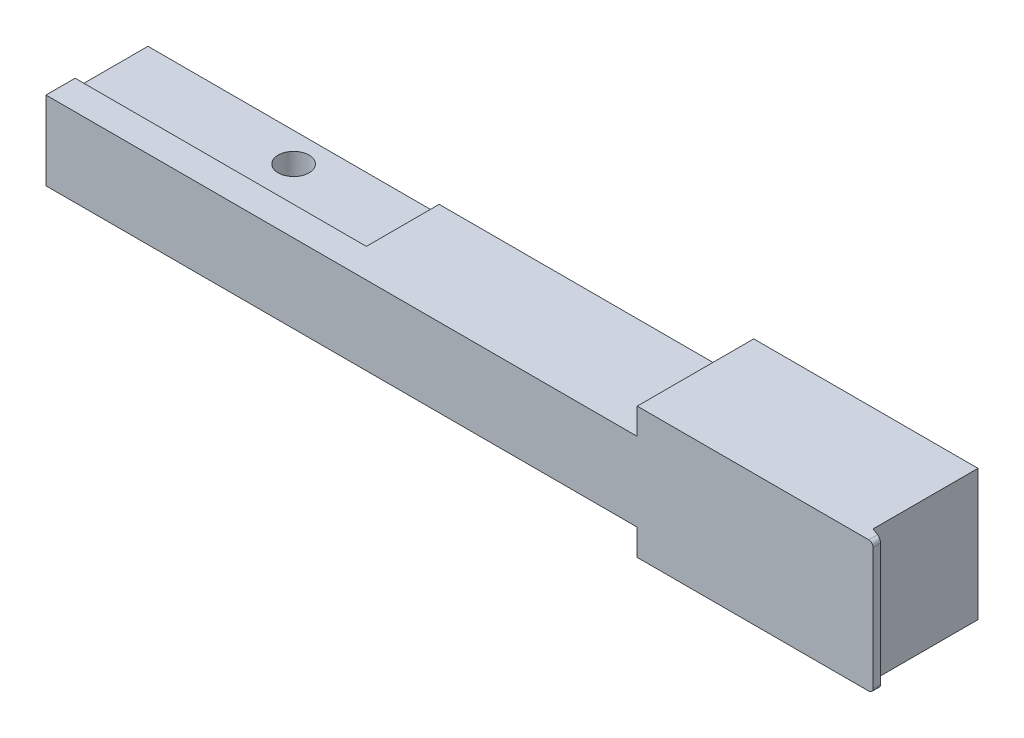
ISO-10303-21;
HEADER;
FILE_DESCRIPTION(('STEP AP214'),'2;1');
FILE_NAME('part.step','',(''),(''),'','','');
FILE_SCHEMA(('AUTOMOTIVE_DESIGN { 1 0 10303 214 1 1 1 1 }'));
ENDSEC;
DATA;
#1=APPLICATION_CONTEXT('core data for automotive mechanical design processes');
#2=APPLICATION_PROTOCOL_DEFINITION('international standard','automotive_design',2000,#1);
#3=PRODUCT_CONTEXT('',#1,'mechanical');
#4=PRODUCT('Part','Part','',(#3));
#5=PRODUCT_RELATED_PRODUCT_CATEGORY('part','',(#4));
#6=PRODUCT_DEFINITION_FORMATION('','',#4);
#7=PRODUCT_DEFINITION_CONTEXT('part definition',#1,'design');
#8=PRODUCT_DEFINITION('design','',#6,#7);
#9=PRODUCT_DEFINITION_SHAPE('','',#8);
#10=(LENGTH_UNIT() NAMED_UNIT(*) SI_UNIT(.MILLI.,.METRE.));
#11=(NAMED_UNIT(*) PLANE_ANGLE_UNIT() SI_UNIT($,.RADIAN.));
#12=(NAMED_UNIT(*) SI_UNIT($,.STERADIAN.) SOLID_ANGLE_UNIT());
#13=UNCERTAINTY_MEASURE_WITH_UNIT(LENGTH_MEASURE(1.E-05),#10,'distance_accuracy_value','');
#14=(GEOMETRIC_REPRESENTATION_CONTEXT(3) GLOBAL_UNCERTAINTY_ASSIGNED_CONTEXT((#13)) GLOBAL_UNIT_ASSIGNED_CONTEXT((#10,
#11,#12)) REPRESENTATION_CONTEXT('',''));
#15=CARTESIAN_POINT('',(0.,0.,0.));
#16=DIRECTION('',(0.,0.,1.));
#17=DIRECTION('',(1.,0.,0.));
#18=AXIS2_PLACEMENT_3D('',#15,#16,#17);
#19=CARTESIAN_POINT('',(14.9778979635514,-0.0832945479073734,9.67523553853474));
#20=DIRECTION('',(0.,1.,0.));
#21=DIRECTION('',(-1.,0.,0.));
#22=AXIS2_PLACEMENT_3D('',#19,#20,#21);
#23=CYLINDRICAL_SURFACE('',#22,2.65);
#24=CARTESIAN_POINT('',(14.9778979635514,16.4177054520927,9.67523553853474));
#25=DIRECTION('',(0.,1.,0.));
#26=DIRECTION('',(0.,0.,1.));
#27=AXIS2_PLACEMENT_3D('',#24,#25,#26);
#28=CIRCLE('',#27,2.65);
#29=CARTESIAN_POINT('',(14.9778979635514,16.4177054520927,12.3252355385347));
#30=VERTEX_POINT('',#29);
#31=EDGE_CURVE('E48',#30,#30,#28,.F.);
#32=ORIENTED_EDGE('',*,*,#31,.F.);
#33=EDGE_LOOP('',(#32));
#34=FACE_BOUND('',#33,.T.);
#35=CARTESIAN_POINT('',(14.9778979635514,5.91770545209266,9.67523553853474));
#36=DIRECTION('',(0.,-1.,0.));
#37=DIRECTION('',(0.,0.,-1.));
#38=AXIS2_PLACEMENT_3D('',#35,#36,#37);
#39=CIRCLE('',#38,2.65);
#40=CARTESIAN_POINT('',(14.9778979635514,5.91770545209266,7.02523553853475));
#41=VERTEX_POINT('',#40);
#42=EDGE_CURVE('E418',#41,#41,#39,.F.);
#43=ORIENTED_EDGE('',*,*,#42,.F.);
#44=EDGE_LOOP('',(#43));
#45=FACE_BOUND('',#44,.T.);
#46=ADVANCED_FACE('F44',(#34,#45),#23,.F.);
#47=CARTESIAN_POINT('',(-15.0221020364486,-0.0822945479073411,2.17523553853475));
#48=DIRECTION('',(1.,0.,0.));
#49=DIRECTION('',(0.,0.,-1.));
#50=AXIS2_PLACEMENT_3D('',#47,#48,#49);
#51=PLANE('',#50);
#52=DIRECTION('',(0.,-1.,0.));
#53=VECTOR('',#52,1.);
#54=CARTESIAN_POINT('',(-15.0221020364486,5.91770545209266,17.1752355385347));
#55=LINE('',#54,#53);
#56=CARTESIAN_POINT('',(-15.0221020364486,5.91770545209266,17.1752355385347));
#57=VERTEX_POINT('',#56);
#58=CARTESIAN_POINT('',(-15.0221020364486,4.41770545209266,17.1752355385347));
#59=VERTEX_POINT('',#58);
#60=EDGE_CURVE('E347',#57,#59,#55,.T.);
#61=ORIENTED_EDGE('',*,*,#60,.T.);
#62=DIRECTION('',(0.,0.,1.));
#63=VECTOR('',#62,1.);
#64=CARTESIAN_POINT('',(-15.0221020364486,4.41770545209266,2.17423553853474));
#65=LINE('',#64,#63);
#66=CARTESIAN_POINT('',(-15.0221020364486,4.41770545209266,22.1752355385347));
#67=VERTEX_POINT('',#66);
#68=EDGE_CURVE('E216',#59,#67,#65,.T.);
#69=ORIENTED_EDGE('',*,*,#68,.T.);
#70=DIRECTION('',(0.,1.,0.));
#71=VECTOR('',#70,1.);
#72=CARTESIAN_POINT('',(-15.0221020364486,-0.0822945479073411,22.1752355385347));
#73=LINE('',#72,#71);
#74=CARTESIAN_POINT('',(-15.0221020364486,17.9177054520927,22.1752355385347));
#75=VERTEX_POINT('',#74);
#76=EDGE_CURVE('E223',#67,#75,#73,.T.);
#77=ORIENTED_EDGE('',*,*,#76,.T.);
#78=DIRECTION('',(0.,0.,1.));
#79=VECTOR('',#78,1.);
#80=CARTESIAN_POINT('',(-15.0221020364486,17.9177054520927,2.17423553853474));
#81=LINE('',#80,#79);
#82=CARTESIAN_POINT('',(-15.0221020364486,17.9177054520927,17.1752355385347));
#83=VERTEX_POINT('',#82);
#84=EDGE_CURVE('E306',#83,#75,#81,.T.);
#85=ORIENTED_EDGE('',*,*,#84,.F.);
#86=DIRECTION('',(0.,1.,0.));
#87=VECTOR('',#86,1.);
#88=CARTESIAN_POINT('',(-15.0221020364486,16.4177054520927,17.1752355385347));
#89=LINE('',#88,#87);
#90=CARTESIAN_POINT('',(-15.0221020364486,16.4177054520927,17.1752355385347));
#91=VERTEX_POINT('',#90);
#92=EDGE_CURVE('E68',#91,#83,#89,.T.);
#93=ORIENTED_EDGE('',*,*,#92,.F.);
#94=DIRECTION('',(0.,0.,1.));
#95=VECTOR('',#94,1.);
#96=CARTESIAN_POINT('',(-15.0221020364486,16.4177054520927,4.67523553853474));
#97=LINE('',#96,#95);
#98=CARTESIAN_POINT('',(-15.0221020364486,16.4177054520927,4.67523553853474));
#99=VERTEX_POINT('',#98);
#100=EDGE_CURVE('E201',#99,#91,#97,.T.);
#101=ORIENTED_EDGE('',*,*,#100,.F.);
#102=DIRECTION('',(0.,1.,0.));
#103=VECTOR('',#102,1.);
#104=CARTESIAN_POINT('',(-15.0221020364486,-0.0822945479073585,4.67523553853474));
#105=LINE('',#104,#103);
#106=CARTESIAN_POINT('',(-15.0221020364486,5.91770545209266,4.67523553853474));
#107=VERTEX_POINT('',#106);
#108=EDGE_CURVE('E193',#107,#99,#105,.T.);
#109=ORIENTED_EDGE('',*,*,#108,.F.);
#110=DIRECTION('',(0.,0.,1.));
#111=VECTOR('',#110,1.);
#112=CARTESIAN_POINT('',(-15.0221020364486,5.91770545209266,4.67523553853474));
#113=LINE('',#112,#111);
#114=EDGE_CURVE('E177',#107,#57,#113,.T.);
#115=ORIENTED_EDGE('',*,*,#114,.T.);
#116=EDGE_LOOP('',(#61,#69,#77,#85,#93,#101,#109,#115));
#117=FACE_BOUND('',#116,.T.);
#118=ADVANCED_FACE('F199',(#117),#51,.F.);
#119=CARTESIAN_POINT('',(84.9778979635514,-0.0822945479073446,4.67523553853474));
#120=DIRECTION('',(0.,0.,1.));
#121=DIRECTION('',(1.,0.,0.));
#122=AXIS2_PLACEMENT_3D('',#119,#120,#121);
#123=PLANE('',#122);
#124=DIRECTION('',(0.,-1.,0.));
#125=VECTOR('',#124,1.);
#126=CARTESIAN_POINT('',(34.9778979635514,5.91770545209266,4.67523553853474));
#127=LINE('',#126,#125);
#128=CARTESIAN_POINT('',(34.9778979635514,5.91770545209266,4.67523553853474));
#129=VERTEX_POINT('',#128);
#130=CARTESIAN_POINT('',(34.9778979635514,4.41770545209266,4.67523553853474));
#131=VERTEX_POINT('',#130);
#132=EDGE_CURVE('E60',#129,#131,#127,.T.);
#133=ORIENTED_EDGE('',*,*,#132,.F.);
#134=DIRECTION('',(-1.,0.,0.));
#135=VECTOR('',#134,1.);
#136=CARTESIAN_POINT('',(-15.0221020364486,5.91770545209266,4.67523553853474));
#137=LINE('',#136,#135);
#138=EDGE_CURVE('E182',#129,#107,#137,.T.);
#139=ORIENTED_EDGE('',*,*,#138,.T.);
#140=ORIENTED_EDGE('',*,*,#108,.T.);
#141=DIRECTION('',(-1.,0.,0.));
#142=VECTOR('',#141,1.);
#143=CARTESIAN_POINT('',(-15.0221020364486,16.4177054520927,4.67523553853474));
#144=LINE('',#143,#142);
#145=CARTESIAN_POINT('',(34.9778979635514,16.4177054520927,4.67523553853474));
#146=VERTEX_POINT('',#145);
#147=EDGE_CURVE('E424',#146,#99,#144,.T.);
#148=ORIENTED_EDGE('',*,*,#147,.F.);
#149=DIRECTION('',(0.,1.,0.));
#150=VECTOR('',#149,1.);
#151=CARTESIAN_POINT('',(34.9778979635514,16.4177054520927,4.67523553853474));
#152=LINE('',#151,#150);
#153=CARTESIAN_POINT('',(34.9778979635514,17.9177054520927,4.67523553853474));
#154=VERTEX_POINT('',#153);
#155=EDGE_CURVE('E412',#146,#154,#152,.T.);
#156=ORIENTED_EDGE('',*,*,#155,.T.);
#157=DIRECTION('',(-1.,0.,0.));
#158=VECTOR('',#157,1.);
#159=CARTESIAN_POINT('',(-15.0221020364486,17.9177054520927,4.67523553853474));
#160=LINE('',#159,#158);
#161=CARTESIAN_POINT('',(84.9778979635514,17.9177054520927,4.67523553853474));
#162=VERTEX_POINT('',#161);
#163=EDGE_CURVE('E308',#162,#154,#160,.T.);
#164=ORIENTED_EDGE('',*,*,#163,.F.);
#165=DIRECTION('',(0.,1.,0.));
#166=VECTOR('',#165,1.);
#167=CARTESIAN_POINT('',(84.9778979635514,-0.0822945479073446,4.67523553853474));
#168=LINE('',#167,#166);
#169=CARTESIAN_POINT('',(84.9778979635514,4.41770545209266,4.67523553853474));
#170=VERTEX_POINT('',#169);
#171=EDGE_CURVE('E214',#170,#162,#168,.T.);
#172=ORIENTED_EDGE('',*,*,#171,.F.);
#173=DIRECTION('',(1.,0.,0.));
#174=VECTOR('',#173,1.);
#175=CARTESIAN_POINT('',(-15.0221020364486,4.41770545209266,4.67523553853474));
#176=LINE('',#175,#174);
#177=EDGE_CURVE('E320',#131,#170,#176,.T.);
#178=ORIENTED_EDGE('',*,*,#177,.F.);
#179=EDGE_LOOP('',(#133,#139,#140,#148,#156,#164,#172,#178));
#180=FACE_BOUND('',#179,.T.);
#181=ADVANCED_FACE('F191',(#180),#123,.F.);
#182=CARTESIAN_POINT('',(-15.0221020364486,4.41770545209266,2.17423553853474));
#183=DIRECTION('',(0.,1.,0.));
#184=DIRECTION('',(0.,0.,1.));
#185=AXIS2_PLACEMENT_3D('',#182,#183,#184);
#186=PLANE('',#185);
#187=DIRECTION('',(1.,0.,0.));
#188=VECTOR('',#187,1.);
#189=CARTESIAN_POINT('',(-15.0221020364486,4.41770545209266,17.1752355385347));
#190=LINE('',#189,#188);
#191=CARTESIAN_POINT('',(34.9778979635514,4.41770545209266,17.1752355385347));
#192=VERTEX_POINT('',#191);
#193=EDGE_CURVE('E188',#59,#192,#190,.T.);
#194=ORIENTED_EDGE('',*,*,#193,.T.);
#195=DIRECTION('',(0.,0.,-1.));
#196=VECTOR('',#195,1.);
#197=CARTESIAN_POINT('',(34.9778979635514,4.41770545209266,4.67523553853474));
#198=LINE('',#197,#196);
#199=EDGE_CURVE('E439',#192,#131,#198,.T.);
#200=ORIENTED_EDGE('',*,*,#199,.T.);
#201=ORIENTED_EDGE('',*,*,#177,.T.);
#202=DIRECTION('',(0.514495755427527,0.,-0.857492925712544));
#203=VECTOR('',#202,1.);
#204=CARTESIAN_POINT('',(59.6106920811984,4.41770545209266,46.953912009123));
#205=LINE('',#204,#203);
#206=CARTESIAN_POINT('',(86.4778979635514,4.41770545209266,2.17523553853475));
#207=VERTEX_POINT('',#206);
#208=EDGE_CURVE('E316',#170,#207,#205,.T.);
#209=ORIENTED_EDGE('',*,*,#208,.T.);
#210=DIRECTION('',(0.,0.,1.));
#211=VECTOR('',#210,1.);
#212=CARTESIAN_POINT('',(86.4778979635514,4.41770545209266,2.17423553853474));
#213=LINE('',#212,#211);
#214=CARTESIAN_POINT('',(86.4778979635514,4.41770545209266,22.1752355385347));
#215=VERTEX_POINT('',#214);
#216=EDGE_CURVE('E337',#207,#215,#213,.T.);
#217=ORIENTED_EDGE('',*,*,#216,.T.);
#218=DIRECTION('',(-1.,0.,0.));
#219=VECTOR('',#218,1.);
#220=CARTESIAN_POINT('',(-15.0221020364486,4.41770545209266,22.1752355385347));
#221=LINE('',#220,#219);
#222=EDGE_CURVE('E332',#215,#67,#221,.T.);
#223=ORIENTED_EDGE('',*,*,#222,.T.);
#224=ORIENTED_EDGE('',*,*,#68,.F.);
#225=EDGE_LOOP('',(#194,#200,#201,#209,#217,#223,#224));
#226=FACE_BOUND('',#225,.T.);
#227=ADVANCED_FACE('F349',(#226),#186,.F.);
#228=CARTESIAN_POINT('',(-15.0221020364486,22.4177054520927,2.17523553853475));
#229=DIRECTION('',(0.,-1.,0.));
#230=DIRECTION('',(1.,0.,0.));
#231=AXIS2_PLACEMENT_3D('',#228,#229,#230);
#232=PLANE('',#231);
#233=DIRECTION('',(1.,0.,0.));
#234=VECTOR('',#233,1.);
#235=CARTESIAN_POINT('',(-15.0221020364486,22.4177054520927,2.17523553853475));
#236=LINE('',#235,#234);
#237=CARTESIAN_POINT('',(86.4778979635514,22.4177054520927,2.17523553853474));
#238=VERTEX_POINT('',#237);
#239=CARTESIAN_POINT('',(124.977897963551,22.4177054520927,2.17523553853475));
#240=VERTEX_POINT('',#239);
#241=EDGE_CURVE('E224',#238,#240,#236,.T.);
#242=ORIENTED_EDGE('',*,*,#241,.F.);
#243=DIRECTION('',(0.,0.,1.));
#244=VECTOR('',#243,1.);
#245=CARTESIAN_POINT('',(86.4778979635514,22.4177054520927,2.17423553853474));
#246=LINE('',#245,#244);
#247=CARTESIAN_POINT('',(86.4778979635514,22.4177054520927,22.1752355385347));
#248=VERTEX_POINT('',#247);
#249=EDGE_CURVE('E299',#238,#248,#246,.T.);
#250=ORIENTED_EDGE('',*,*,#249,.T.);
#251=DIRECTION('',(1.,0.,0.));
#252=VECTOR('',#251,1.);
#253=CARTESIAN_POINT('',(-15.0221020364486,22.4177054520927,22.1752355385347));
#254=LINE('',#253,#252);
#255=CARTESIAN_POINT('',(126.227897963551,22.4177054520927,22.1752355385347));
#256=VERTEX_POINT('',#255);
#257=EDGE_CURVE('E232',#248,#256,#254,.T.);
#258=ORIENTED_EDGE('',*,*,#257,.T.);
#259=DIRECTION('',(0.,0.,1.));
#260=VECTOR('',#259,1.);
#261=CARTESIAN_POINT('',(126.227897963551,22.4177054520927,20.9252355385348));
#262=LINE('',#261,#260);
#263=CARTESIAN_POINT('',(126.227897963551,22.4177054520927,20.6522578628351));
#264=VERTEX_POINT('',#263);
#265=EDGE_CURVE('E11',#256,#264,#262,.F.);
#266=ORIENTED_EDGE('',*,*,#265,.T.);
#267=DIRECTION('',(0.939692620785909,0.,0.342020143325667));
#268=VECTOR('',#267,1.);
#269=CARTESIAN_POINT('',(126.977897963551,22.4177054520927,20.9252355385348));
#270=LINE('',#269,#268);
#271=CARTESIAN_POINT('',(124.977897963551,22.4177054520927,20.1972950700024));
#272=VERTEX_POINT('',#271);
#273=EDGE_CURVE('E240',#264,#272,#270,.F.);
#274=ORIENTED_EDGE('',*,*,#273,.T.);
#275=DIRECTION('',(0.,0.,1.));
#276=VECTOR('',#275,1.);
#277=CARTESIAN_POINT('',(124.977897963551,22.4177054520927,2.17523553853475));
#278=LINE('',#277,#276);
#279=EDGE_CURVE('E205',#240,#272,#278,.T.);
#280=ORIENTED_EDGE('',*,*,#279,.F.);
#281=EDGE_LOOP('',(#242,#250,#258,#266,#274,#280));
#282=FACE_BOUND('',#281,.T.);
#283=ADVANCED_FACE('F297',(#282),#232,.F.);
#284=CARTESIAN_POINT('',(126.977897963551,-0.0822945479073238,2.17523553853475));
#285=DIRECTION('',(1.,0.,0.));
#286=DIRECTION('',(0.,0.,-1.));
#287=AXIS2_PLACEMENT_3D('',#284,#285,#286);
#288=PLANE('',#287);
#289=DIRECTION('',(0.,1.,0.));
#290=VECTOR('',#289,1.);
#291=CARTESIAN_POINT('',(126.977897963551,-0.0822945479073238,22.1752355385347));
#292=LINE('',#291,#290);
#293=CARTESIAN_POINT('',(126.977897963551,0.667705452092676,22.1752355385347));
#294=VERTEX_POINT('',#293);
#295=CARTESIAN_POINT('',(126.977897963551,21.6677054520927,22.1752355385347));
#296=VERTEX_POINT('',#295);
#297=EDGE_CURVE('E234',#294,#296,#292,.T.);
#298=ORIENTED_EDGE('',*,*,#297,.F.);
#299=DIRECTION('',(0.,0.,1.));
#300=VECTOR('',#299,1.);
#301=CARTESIAN_POINT('',(126.977897963551,0.667705452092676,2.17523553853475));
#302=LINE('',#301,#300);
#303=CARTESIAN_POINT('',(126.977897963551,0.667705452092676,20.9252355385348));
#304=VERTEX_POINT('',#303);
#305=EDGE_CURVE('E259',#294,#304,#302,.F.);
#306=ORIENTED_EDGE('',*,*,#305,.T.);
#307=DIRECTION('',(0.,1.,0.));
#308=VECTOR('',#307,1.);
#309=CARTESIAN_POINT('',(126.977897963551,-0.0822945479073238,20.9252355385348));
#310=LINE('',#309,#308);
#311=CARTESIAN_POINT('',(126.977897963551,21.6677054520927,20.9252355385348));
#312=VERTEX_POINT('',#311);
#313=EDGE_CURVE('E229',#304,#312,#310,.T.);
#314=ORIENTED_EDGE('',*,*,#313,.T.);
#315=DIRECTION('',(0.,0.,1.));
#316=VECTOR('',#315,1.);
#317=CARTESIAN_POINT('',(126.977897963551,21.6677054520927,22.1752355385347));
#318=LINE('',#317,#316);
#319=EDGE_CURVE('E256',#312,#296,#318,.T.);
#320=ORIENTED_EDGE('',*,*,#319,.T.);
#321=EDGE_LOOP('',(#298,#306,#314,#320));
#322=FACE_BOUND('',#321,.T.);
#323=ADVANCED_FACE('F285',(#322),#288,.T.);
#324=CARTESIAN_POINT('',(-15.0221020364486,-0.0822945479073411,2.17523553853475));
#325=DIRECTION('',(0.,-1.,0.));
#326=DIRECTION('',(1.,0.,0.));
#327=AXIS2_PLACEMENT_3D('',#324,#325,#326);
#328=PLANE('',#327);
#329=DIRECTION('',(0.,0.,1.));
#330=VECTOR('',#329,1.);
#331=CARTESIAN_POINT('',(86.4778979635514,-0.0822945479073411,2.17423553853474));
#332=LINE('',#331,#330);
#333=CARTESIAN_POINT('',(86.4778979635514,-0.0822945479073411,2.17523553853474));
#334=VERTEX_POINT('',#333);
#335=CARTESIAN_POINT('',(86.4778979635514,-0.0822945479073411,22.1752355385347));
#336=VERTEX_POINT('',#335);
#337=EDGE_CURVE('E335',#334,#336,#332,.T.);
#338=ORIENTED_EDGE('',*,*,#337,.F.);
#339=DIRECTION('',(1.,0.,0.));
#340=VECTOR('',#339,1.);
#341=CARTESIAN_POINT('',(-15.0221020364486,-0.0822945479073411,2.17523553853475));
#342=LINE('',#341,#340);
#343=CARTESIAN_POINT('',(124.977897963551,-0.082294547907324,2.17523553853475));
#344=VERTEX_POINT('',#343);
#345=EDGE_CURVE('E226',#334,#344,#342,.T.);
#346=ORIENTED_EDGE('',*,*,#345,.T.);
#347=DIRECTION('',(0.,0.,1.));
#348=VECTOR('',#347,1.);
#349=CARTESIAN_POINT('',(124.977897963551,-0.0822945479073166,2.17523553853475));
#350=LINE('',#349,#348);
#351=CARTESIAN_POINT('',(124.977897963551,-0.082294547907324,20.1972950700024));
#352=VERTEX_POINT('',#351);
#353=EDGE_CURVE('E202',#344,#352,#350,.T.);
#354=ORIENTED_EDGE('',*,*,#353,.T.);
#355=DIRECTION('',(-0.939692620785909,0.,-0.342020143325667));
#356=VECTOR('',#355,1.);
#357=CARTESIAN_POINT('',(-4.43739133870753,-0.0822945479073398,-26.9060180949689));
#358=LINE('',#357,#356);
#359=CARTESIAN_POINT('',(126.227897963551,-0.0822945479073239,20.6522578628351));
#360=VERTEX_POINT('',#359);
#361=EDGE_CURVE('E242',#352,#360,#358,.F.);
#362=ORIENTED_EDGE('',*,*,#361,.T.);
#363=DIRECTION('',(0.,0.,1.));
#364=VECTOR('',#363,1.);
#365=CARTESIAN_POINT('',(126.227897963551,-0.0822945479073239,2.17523553853475));
#366=LINE('',#365,#364);
#367=CARTESIAN_POINT('',(126.227897963551,-0.0822945479073239,22.1752355385347));
#368=VERTEX_POINT('',#367);
#369=EDGE_CURVE('E248',#360,#368,#366,.T.);
#370=ORIENTED_EDGE('',*,*,#369,.T.);
#371=DIRECTION('',(1.,0.,0.));
#372=VECTOR('',#371,1.);
#373=CARTESIAN_POINT('',(-15.0221020364486,-0.0822945479073411,22.1752355385347));
#374=LINE('',#373,#372);
#375=EDGE_CURVE('E227',#336,#368,#374,.T.);
#376=ORIENTED_EDGE('',*,*,#375,.F.);
#377=EDGE_LOOP('',(#338,#346,#354,#362,#370,#376));
#378=FACE_BOUND('',#377,.T.);
#379=ADVANCED_FACE('F274',(#378),#328,.T.);
#380=CARTESIAN_POINT('',(-15.0221020364486,-0.0822945479073411,2.17523553853475));
#381=DIRECTION('',(0.,0.,-1.));
#382=DIRECTION('',(-1.,0.,0.));
#383=AXIS2_PLACEMENT_3D('',#380,#381,#382);
#384=PLANE('',#383);
#385=DIRECTION('',(0.,1.,0.));
#386=VECTOR('',#385,1.);
#387=CARTESIAN_POINT('',(86.4778979635514,-0.0822945479073446,2.17523553853475));
#388=LINE('',#387,#386);
#389=EDGE_CURVE('E203',#334,#207,#388,.T.);
#390=ORIENTED_EDGE('',*,*,#389,.T.);
#391=CARTESIAN_POINT('',(86.4778979635514,17.9177054520927,2.17523553853475));
#392=VERTEX_POINT('',#391);
#393=EDGE_CURVE('E208',#207,#392,#388,.T.);
#394=ORIENTED_EDGE('',*,*,#393,.T.);
#395=DIRECTION('',(0.,1.,0.));
#396=VECTOR('',#395,1.);
#397=CARTESIAN_POINT('',(86.4778979635514,-0.0822945479073446,2.17523553853475));
#398=LINE('',#397,#396);
#399=EDGE_CURVE('E211',#392,#238,#398,.T.);
#400=ORIENTED_EDGE('',*,*,#399,.T.);
#401=ORIENTED_EDGE('',*,*,#241,.T.);
#402=DIRECTION('',(0.,1.,0.));
#403=VECTOR('',#402,1.);
#404=CARTESIAN_POINT('',(124.977897963551,-0.0822945479073166,2.17523553853475));
#405=LINE('',#404,#403);
#406=EDGE_CURVE('E220',#344,#240,#405,.T.);
#407=ORIENTED_EDGE('',*,*,#406,.F.);
#408=ORIENTED_EDGE('',*,*,#345,.F.);
#409=EDGE_LOOP('',(#390,#394,#400,#401,#407,#408));
#410=FACE_BOUND('',#409,.T.);
#411=ADVANCED_FACE('F353',(#410),#384,.T.);
#412=CARTESIAN_POINT('',(-15.0221020364486,-0.0822945479073411,22.1752355385347));
#413=DIRECTION('',(0.,0.,-1.));
#414=DIRECTION('',(-1.,0.,0.));
#415=AXIS2_PLACEMENT_3D('',#412,#413,#414);
#416=PLANE('',#415);
#417=ORIENTED_EDGE('',*,*,#222,.F.);
#418=DIRECTION('',(0.,1.,0.));
#419=VECTOR('',#418,1.);
#420=CARTESIAN_POINT('',(86.4778979635514,-0.0822945479073411,22.1752355385347));
#421=LINE('',#420,#419);
#422=EDGE_CURVE('E325',#336,#215,#421,.T.);
#423=ORIENTED_EDGE('',*,*,#422,.F.);
#424=ORIENTED_EDGE('',*,*,#375,.T.);
#425=CARTESIAN_POINT('',(126.227897963551,0.667705452092676,22.1752355385347));
#426=DIRECTION('',(0.,0.,-1.));
#427=DIRECTION('',(-1.,0.,0.));
#428=AXIS2_PLACEMENT_3D('',#425,#426,#427);
#429=CIRCLE('',#428,0.75);
#430=EDGE_CURVE('E254',#368,#294,#429,.F.);
#431=ORIENTED_EDGE('',*,*,#430,.T.);
#432=ORIENTED_EDGE('',*,*,#297,.T.);
#433=CARTESIAN_POINT('',(126.227897963551,21.6677054520927,22.1752355385347));
#434=DIRECTION('',(0.,0.,-1.));
#435=DIRECTION('',(-1.,0.,0.));
#436=AXIS2_PLACEMENT_3D('',#433,#434,#435);
#437=CIRCLE('',#436,0.75);
#438=EDGE_CURVE('E251',#296,#256,#437,.F.);
#439=ORIENTED_EDGE('',*,*,#438,.T.);
#440=ORIENTED_EDGE('',*,*,#257,.F.);
#441=DIRECTION('',(0.,1.,0.));
#442=VECTOR('',#441,1.);
#443=CARTESIAN_POINT('',(86.4778979635514,22.4177054520927,22.1752355385347));
#444=LINE('',#443,#442);
#445=CARTESIAN_POINT('',(86.4778979635514,17.9177054520927,22.1752355385347));
#446=VERTEX_POINT('',#445);
#447=EDGE_CURVE('E293',#446,#248,#444,.T.);
#448=ORIENTED_EDGE('',*,*,#447,.F.);
#449=DIRECTION('',(1.,0.,0.));
#450=VECTOR('',#449,1.);
#451=CARTESIAN_POINT('',(-15.0221020364486,17.9177054520927,22.1752355385347));
#452=LINE('',#451,#450);
#453=EDGE_CURVE('E312',#75,#446,#452,.T.);
#454=ORIENTED_EDGE('',*,*,#453,.F.);
#455=ORIENTED_EDGE('',*,*,#76,.F.);
#456=EDGE_LOOP('',(#417,#423,#424,#431,#432,#439,#440,#448,#454,#455));
#457=FACE_BOUND('',#456,.T.);
#458=ADVANCED_FACE('F282',(#457),#416,.F.);
#459=CARTESIAN_POINT('',(124.977897963551,-0.0822945479073411,22.1752355385347));
#460=DIRECTION('',(-1.,0.,0.));
#461=DIRECTION('',(0.,0.,1.));
#462=AXIS2_PLACEMENT_3D('',#459,#460,#461);
#463=PLANE('',#462);
#464=ORIENTED_EDGE('',*,*,#353,.F.);
#465=ORIENTED_EDGE('',*,*,#406,.T.);
#466=ORIENTED_EDGE('',*,*,#279,.T.);
#467=DIRECTION('',(0.,1.,0.));
#468=VECTOR('',#467,1.);
#469=CARTESIAN_POINT('',(124.977897963551,-0.0822945479073411,20.1972950700024));
#470=LINE('',#469,#468);
#471=EDGE_CURVE('E245',#272,#352,#470,.F.);
#472=ORIENTED_EDGE('',*,*,#471,.T.);
#473=EDGE_LOOP('',(#464,#465,#466,#472));
#474=FACE_BOUND('',#473,.T.);
#475=ADVANCED_FACE('F355',(#474),#463,.F.);
#476=CARTESIAN_POINT('',(126.977897963551,-0.0822945479073238,20.9252355385348));
#477=DIRECTION('',(-0.342020143325667,0.,0.939692620785909));
#478=DIRECTION('',(0.,1.,0.));
#479=AXIS2_PLACEMENT_3D('',#476,#477,#478);
#480=PLANE('',#479);
#481=ORIENTED_EDGE('',*,*,#313,.F.);
#482=CARTESIAN_POINT('',(126.227897963551,0.667705452092676,20.6522578628351));
#483=DIRECTION('',(-0.342020143325667,0.,0.939692620785909));
#484=DIRECTION('',(0.939692620785909,0.,0.342020143325667));
#485=AXIS2_PLACEMENT_3D('',#482,#483,#484);
#486=ELLIPSE('',#485,0.798133329356934,0.75);
#487=EDGE_CURVE('E53',#304,#360,#486,.F.);
#488=ORIENTED_EDGE('',*,*,#487,.T.);
#489=ORIENTED_EDGE('',*,*,#361,.F.);
#490=ORIENTED_EDGE('',*,*,#471,.F.);
#491=ORIENTED_EDGE('',*,*,#273,.F.);
#492=CARTESIAN_POINT('',(126.227897963551,21.6677054520927,20.6522578628351));
#493=DIRECTION('',(-0.342020143325667,0.,0.939692620785909));
#494=DIRECTION('',(-0.939692620785909,0.,-0.342020143325667));
#495=AXIS2_PLACEMENT_3D('',#492,#493,#494);
#496=ELLIPSE('',#495,0.798133329356934,0.75);
#497=EDGE_CURVE('E261',#264,#312,#496,.F.);
#498=ORIENTED_EDGE('',*,*,#497,.T.);
#499=EDGE_LOOP('',(#481,#488,#489,#490,#491,#498));
#500=FACE_BOUND('',#499,.T.);
#501=ADVANCED_FACE('F267',(#500),#480,.F.);
#502=CARTESIAN_POINT('',(126.227897963551,0.667705452092676,2.17523553853475));
#503=DIRECTION('',(0.,0.,1.));
#504=DIRECTION('',(1.,0.,0.));
#505=AXIS2_PLACEMENT_3D('',#502,#503,#504);
#506=CYLINDRICAL_SURFACE('',#505,0.75);
#507=ORIENTED_EDGE('',*,*,#487,.F.);
#508=ORIENTED_EDGE('',*,*,#305,.F.);
#509=ORIENTED_EDGE('',*,*,#430,.F.);
#510=ORIENTED_EDGE('',*,*,#369,.F.);
#511=EDGE_LOOP('',(#507,#508,#509,#510));
#512=FACE_BOUND('',#511,.T.);
#513=ADVANCED_FACE('F278',(#512),#506,.T.);
#514=CARTESIAN_POINT('',(126.227897963551,21.6677054520927,2.17523553853475));
#515=DIRECTION('',(0.,0.,-1.));
#516=DIRECTION('',(-1.,0.,0.));
#517=AXIS2_PLACEMENT_3D('',#514,#515,#516);
#518=CYLINDRICAL_SURFACE('',#517,0.75);
#519=ORIENTED_EDGE('',*,*,#497,.F.);
#520=ORIENTED_EDGE('',*,*,#265,.F.);
#521=ORIENTED_EDGE('',*,*,#438,.F.);
#522=ORIENTED_EDGE('',*,*,#319,.F.);
#523=EDGE_LOOP('',(#519,#520,#521,#522));
#524=FACE_BOUND('',#523,.T.);
#525=ADVANCED_FACE('F46',(#524),#518,.T.);
#526=CARTESIAN_POINT('',(84.9778979635514,-0.0822945479073446,4.67523553853474));
#527=DIRECTION('',(0.857492925712544,0.,0.514495755427527));
#528=DIRECTION('',(0.514495755427527,0.,-0.857492925712544));
#529=AXIS2_PLACEMENT_3D('',#526,#527,#528);
#530=PLANE('',#529);
#531=ORIENTED_EDGE('',*,*,#393,.F.);
#532=ORIENTED_EDGE('',*,*,#208,.F.);
#533=ORIENTED_EDGE('',*,*,#171,.T.);
#534=DIRECTION('',(-0.514495755427527,0.,0.857492925712544));
#535=VECTOR('',#534,1.);
#536=CARTESIAN_POINT('',(59.6106920811984,17.9177054520927,46.953912009123));
#537=LINE('',#536,#535);
#538=EDGE_CURVE('E304',#392,#162,#537,.T.);
#539=ORIENTED_EDGE('',*,*,#538,.F.);
#540=EDGE_LOOP('',(#531,#532,#533,#539));
#541=FACE_BOUND('',#540,.T.);
#542=ADVANCED_FACE('F381',(#541),#530,.F.);
#543=CARTESIAN_POINT('',(86.4778979635514,22.4177054520927,2.17423553853474));
#544=DIRECTION('',(1.,0.,0.));
#545=DIRECTION('',(0.,0.,-1.));
#546=AXIS2_PLACEMENT_3D('',#543,#544,#545);
#547=PLANE('',#546);
#548=ORIENTED_EDGE('',*,*,#399,.F.);
#549=DIRECTION('',(0.,0.,1.));
#550=VECTOR('',#549,1.);
#551=CARTESIAN_POINT('',(86.4778979635514,17.9177054520927,2.17423553853474));
#552=LINE('',#551,#550);
#553=EDGE_CURVE('E303',#392,#446,#552,.T.);
#554=ORIENTED_EDGE('',*,*,#553,.T.);
#555=ORIENTED_EDGE('',*,*,#447,.T.);
#556=ORIENTED_EDGE('',*,*,#249,.F.);
#557=EDGE_LOOP('',(#548,#554,#555,#556));
#558=FACE_BOUND('',#557,.T.);
#559=ADVANCED_FACE('F379',(#558),#547,.F.);
#560=CARTESIAN_POINT('',(-15.0221020364486,17.9177054520927,2.17423553853474));
#561=DIRECTION('',(0.,-1.,0.));
#562=DIRECTION('',(0.,0.,-1.));
#563=AXIS2_PLACEMENT_3D('',#560,#561,#562);
#564=PLANE('',#563);
#565=ORIENTED_EDGE('',*,*,#163,.T.);
#566=DIRECTION('',(0.,0.,-1.));
#567=VECTOR('',#566,1.);
#568=CARTESIAN_POINT('',(34.9778979635514,17.9177054520927,4.67523553853474));
#569=LINE('',#568,#567);
#570=CARTESIAN_POINT('',(34.9778979635514,17.9177054520927,17.1752355385347));
#571=VERTEX_POINT('',#570);
#572=EDGE_CURVE('E413',#571,#154,#569,.T.);
#573=ORIENTED_EDGE('',*,*,#572,.F.);
#574=DIRECTION('',(1.,0.,0.));
#575=VECTOR('',#574,1.);
#576=CARTESIAN_POINT('',(-15.0221020364486,17.9177054520927,17.1752355385347));
#577=LINE('',#576,#575);
#578=EDGE_CURVE('E344',#83,#571,#577,.T.);
#579=ORIENTED_EDGE('',*,*,#578,.F.);
#580=ORIENTED_EDGE('',*,*,#84,.T.);
#581=ORIENTED_EDGE('',*,*,#453,.T.);
#582=ORIENTED_EDGE('',*,*,#553,.F.);
#583=ORIENTED_EDGE('',*,*,#538,.T.);
#584=EDGE_LOOP('',(#565,#573,#579,#580,#581,#582,#583));
#585=FACE_BOUND('',#584,.T.);
#586=ADVANCED_FACE('F342',(#585),#564,.F.);
#587=CARTESIAN_POINT('',(86.4778979635514,-0.0822945479073411,2.17423553853474));
#588=DIRECTION('',(1.,0.,0.));
#589=DIRECTION('',(0.,0.,-1.));
#590=AXIS2_PLACEMENT_3D('',#587,#588,#589);
#591=PLANE('',#590);
#592=ORIENTED_EDGE('',*,*,#389,.F.);
#593=ORIENTED_EDGE('',*,*,#337,.T.);
#594=ORIENTED_EDGE('',*,*,#422,.T.);
#595=ORIENTED_EDGE('',*,*,#216,.F.);
#596=EDGE_LOOP('',(#592,#593,#594,#595));
#597=FACE_BOUND('',#596,.T.);
#598=ADVANCED_FACE('F398',(#597),#591,.F.);
#599=CARTESIAN_POINT('',(0.,16.4177054520927,0.));
#600=DIRECTION('',(0.,1.,0.));
#601=DIRECTION('',(0.,0.,1.));
#602=AXIS2_PLACEMENT_3D('',#599,#600,#601);
#603=PLANE('',#602);
#604=ORIENTED_EDGE('',*,*,#100,.T.);
#605=DIRECTION('',(1.,0.,0.));
#606=VECTOR('',#605,1.);
#607=CARTESIAN_POINT('',(-15.0221020364486,16.4177054520927,17.1752355385347));
#608=LINE('',#607,#606);
#609=CARTESIAN_POINT('',(34.9778979635514,16.4177054520927,17.1752355385347));
#610=VERTEX_POINT('',#609);
#611=EDGE_CURVE('E416',#91,#610,#608,.T.);
#612=ORIENTED_EDGE('',*,*,#611,.T.);
#613=DIRECTION('',(0.,0.,-1.));
#614=VECTOR('',#613,1.);
#615=CARTESIAN_POINT('',(34.9778979635514,16.4177054520927,4.67523553853474));
#616=LINE('',#615,#614);
#617=EDGE_CURVE('E425',#610,#146,#616,.T.);
#618=ORIENTED_EDGE('',*,*,#617,.T.);
#619=ORIENTED_EDGE('',*,*,#147,.T.);
#620=EDGE_LOOP('',(#604,#612,#618,#619));
#621=FACE_BOUND('',#620,.T.);
#622=ORIENTED_EDGE('',*,*,#31,.T.);
#623=EDGE_LOOP('',(#622));
#624=FACE_BOUND('',#623,.T.);
#625=ADVANCED_FACE('F400',(#621,#624),#603,.T.);
#626=CARTESIAN_POINT('',(34.9778979635514,16.4177054520927,4.67523553853474));
#627=DIRECTION('',(1.,0.,0.));
#628=DIRECTION('',(0.,0.,-1.));
#629=AXIS2_PLACEMENT_3D('',#626,#627,#628);
#630=PLANE('',#629);
#631=ORIENTED_EDGE('',*,*,#572,.T.);
#632=ORIENTED_EDGE('',*,*,#155,.F.);
#633=ORIENTED_EDGE('',*,*,#617,.F.);
#634=DIRECTION('',(0.,1.,0.));
#635=VECTOR('',#634,1.);
#636=CARTESIAN_POINT('',(34.9778979635514,16.4177054520927,17.1752355385347));
#637=LINE('',#636,#635);
#638=EDGE_CURVE('E422',#610,#571,#637,.T.);
#639=ORIENTED_EDGE('',*,*,#638,.T.);
#640=EDGE_LOOP('',(#631,#632,#633,#639));
#641=FACE_BOUND('',#640,.T.);
#642=ADVANCED_FACE('F454',(#641),#630,.F.);
#643=CARTESIAN_POINT('',(-15.0221020364486,16.4177054520927,17.1752355385347));
#644=DIRECTION('',(0.,0.,1.));
#645=DIRECTION('',(1.,0.,0.));
#646=AXIS2_PLACEMENT_3D('',#643,#644,#645);
#647=PLANE('',#646);
#648=ORIENTED_EDGE('',*,*,#578,.T.);
#649=ORIENTED_EDGE('',*,*,#638,.F.);
#650=ORIENTED_EDGE('',*,*,#611,.F.);
#651=ORIENTED_EDGE('',*,*,#92,.T.);
#652=EDGE_LOOP('',(#648,#649,#650,#651));
#653=FACE_BOUND('',#652,.T.);
#654=ADVANCED_FACE('F396',(#653),#647,.F.);
#655=CARTESIAN_POINT('',(0.,5.91770545209266,0.));
#656=DIRECTION('',(0.,-1.,0.));
#657=DIRECTION('',(0.,0.,1.));
#658=AXIS2_PLACEMENT_3D('',#655,#656,#657);
#659=PLANE('',#658);
#660=ORIENTED_EDGE('',*,*,#114,.F.);
#661=ORIENTED_EDGE('',*,*,#138,.F.);
#662=DIRECTION('',(0.,0.,-1.));
#663=VECTOR('',#662,1.);
#664=CARTESIAN_POINT('',(34.9778979635514,5.91770545209266,4.67523553853474));
#665=LINE('',#664,#663);
#666=CARTESIAN_POINT('',(34.9778979635514,5.91770545209266,17.1752355385347));
#667=VERTEX_POINT('',#666);
#668=EDGE_CURVE('E196',#667,#129,#665,.T.);
#669=ORIENTED_EDGE('',*,*,#668,.F.);
#670=DIRECTION('',(1.,0.,0.));
#671=VECTOR('',#670,1.);
#672=CARTESIAN_POINT('',(-15.0221020364486,5.91770545209266,17.1752355385347));
#673=LINE('',#672,#671);
#674=EDGE_CURVE('E183',#57,#667,#673,.T.);
#675=ORIENTED_EDGE('',*,*,#674,.F.);
#676=EDGE_LOOP('',(#660,#661,#669,#675));
#677=FACE_BOUND('',#676,.T.);
#678=ORIENTED_EDGE('',*,*,#42,.T.);
#679=EDGE_LOOP('',(#678));
#680=FACE_BOUND('',#679,.T.);
#681=ADVANCED_FACE('F179',(#677,#680),#659,.T.);
#682=CARTESIAN_POINT('',(-15.0221020364486,5.91770545209266,17.1752355385347));
#683=DIRECTION('',(0.,0.,-1.));
#684=DIRECTION('',(-1.,0.,0.));
#685=AXIS2_PLACEMENT_3D('',#682,#683,#684);
#686=PLANE('',#685);
#687=ORIENTED_EDGE('',*,*,#193,.F.);
#688=ORIENTED_EDGE('',*,*,#60,.F.);
#689=ORIENTED_EDGE('',*,*,#674,.T.);
#690=DIRECTION('',(0.,-1.,0.));
#691=VECTOR('',#690,1.);
#692=CARTESIAN_POINT('',(34.9778979635514,5.91770545209266,17.1752355385347));
#693=LINE('',#692,#691);
#694=EDGE_CURVE('E435',#667,#192,#693,.T.);
#695=ORIENTED_EDGE('',*,*,#694,.T.);
#696=EDGE_LOOP('',(#687,#688,#689,#695));
#697=FACE_BOUND('',#696,.T.);
#698=ADVANCED_FACE('F445',(#697),#686,.T.);
#699=CARTESIAN_POINT('',(34.9778979635514,5.91770545209266,4.67523553853474));
#700=DIRECTION('',(-1.,0.,0.));
#701=DIRECTION('',(0.,0.,1.));
#702=AXIS2_PLACEMENT_3D('',#699,#700,#701);
#703=PLANE('',#702);
#704=ORIENTED_EDGE('',*,*,#199,.F.);
#705=ORIENTED_EDGE('',*,*,#694,.F.);
#706=ORIENTED_EDGE('',*,*,#668,.T.);
#707=ORIENTED_EDGE('',*,*,#132,.T.);
#708=EDGE_LOOP('',(#704,#705,#706,#707));
#709=FACE_BOUND('',#708,.T.);
#710=ADVANCED_FACE('F443',(#709),#703,.T.);
#711=CLOSED_SHELL('',(#46,#118,#181,#227,#283,#323,#379,#411,#458,#475,#501,#513,#525,#542,#559,
#586,#598,#625,#642,#654,#681,#698,#710));
#712=MANIFOLD_SOLID_BREP('B2',#711);
#713=ADVANCED_BREP_SHAPE_REPRESENTATION('',(#18,#712),#14);
#714=SHAPE_DEFINITION_REPRESENTATION(#9,#713);
ENDSEC;
END-ISO-10303-21;
